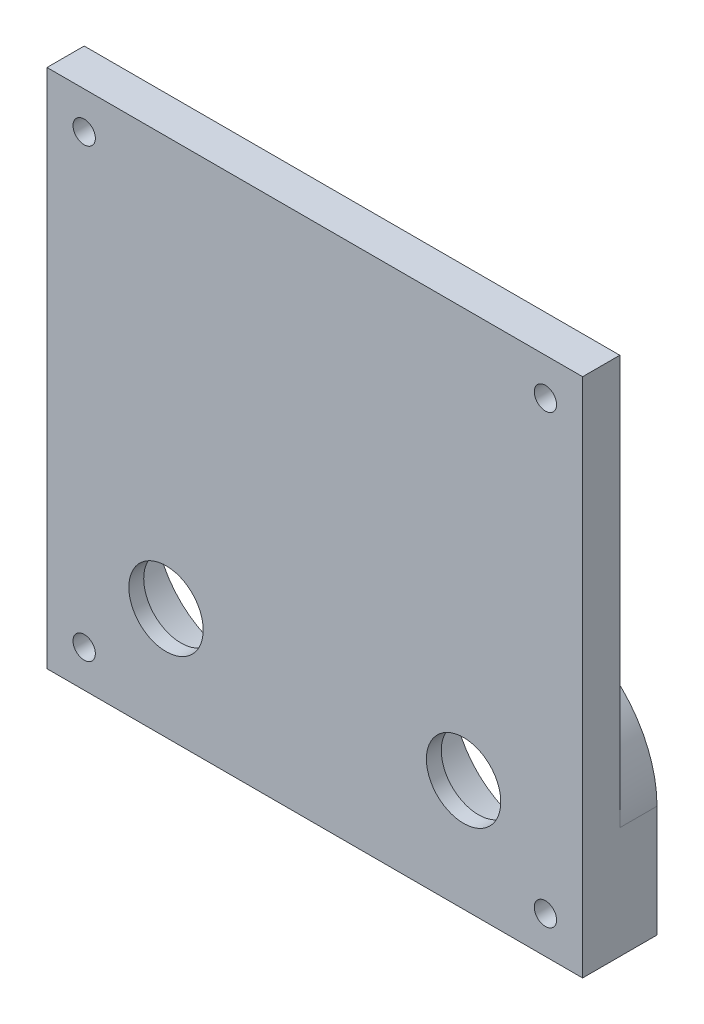
ISO-10303-21;
HEADER;
FILE_DESCRIPTION(('STEP AP214'),'2;1');
FILE_NAME('part.step','',(''),(''),'','','');
FILE_SCHEMA(('AUTOMOTIVE_DESIGN { 1 0 10303 214 1 1 1 1 }'));
ENDSEC;
DATA;
#1=APPLICATION_CONTEXT('core data for automotive mechanical design processes');
#2=APPLICATION_PROTOCOL_DEFINITION('international standard','automotive_design',2000,#1);
#3=PRODUCT_CONTEXT('',#1,'mechanical');
#4=PRODUCT('Part','Part','',(#3));
#5=PRODUCT_RELATED_PRODUCT_CATEGORY('part','',(#4));
#6=PRODUCT_DEFINITION_FORMATION('','',#4);
#7=PRODUCT_DEFINITION_CONTEXT('part definition',#1,'design');
#8=PRODUCT_DEFINITION('design','',#6,#7);
#9=PRODUCT_DEFINITION_SHAPE('','',#8);
#10=(LENGTH_UNIT() NAMED_UNIT(*) SI_UNIT(.MILLI.,.METRE.));
#11=(NAMED_UNIT(*) PLANE_ANGLE_UNIT() SI_UNIT($,.RADIAN.));
#12=(NAMED_UNIT(*) SI_UNIT($,.STERADIAN.) SOLID_ANGLE_UNIT());
#13=UNCERTAINTY_MEASURE_WITH_UNIT(LENGTH_MEASURE(1.E-05),#10,'distance_accuracy_value','');
#14=(GEOMETRIC_REPRESENTATION_CONTEXT(3) GLOBAL_UNCERTAINTY_ASSIGNED_CONTEXT((#13)) GLOBAL_UNIT_ASSIGNED_CONTEXT((#10,
#11,#12)) REPRESENTATION_CONTEXT('',''));
#15=CARTESIAN_POINT('',(0.,0.,0.));
#16=DIRECTION('',(0.,0.,1.));
#17=DIRECTION('',(1.,0.,0.));
#18=AXIS2_PLACEMENT_3D('',#15,#16,#17);
#19=CARTESIAN_POINT('',(59.5583044534633,70.,9.99999999999999));
#20=DIRECTION('',(0.,1.,0.));
#21=DIRECTION('',(0.,0.,1.));
#22=AXIS2_PLACEMENT_3D('',#19,#20,#21);
#23=PLANE('',#22);
#24=DIRECTION('',(1.,0.,0.));
#25=VECTOR('',#24,1.);
#26=CARTESIAN_POINT('',(59.5583044534633,70.,5.));
#27=LINE('',#26,#25);
#28=CARTESIAN_POINT('',(-1.,70.,5.));
#29=VERTEX_POINT('',#28);
#30=CARTESIAN_POINT('',(71.,70.,5.));
#31=VERTEX_POINT('',#30);
#32=EDGE_CURVE('E38',#29,#31,#27,.T.);
#33=ORIENTED_EDGE('',*,*,#32,.F.);
#34=DIRECTION('',(0.,0.,-1.));
#35=VECTOR('',#34,1.);
#36=CARTESIAN_POINT('',(-1.,70.,10.));
#37=LINE('',#36,#35);
#38=CARTESIAN_POINT('',(-1.,70.,10.));
#39=VERTEX_POINT('',#38);
#40=EDGE_CURVE('E189',#39,#29,#37,.T.);
#41=ORIENTED_EDGE('',*,*,#40,.F.);
#42=DIRECTION('',(1.,0.,0.));
#43=VECTOR('',#42,1.);
#44=CARTESIAN_POINT('',(59.5583044534633,70.,9.99999999999999));
#45=LINE('',#44,#43);
#46=CARTESIAN_POINT('',(71.,70.,10.));
#47=VERTEX_POINT('',#46);
#48=EDGE_CURVE('E11',#39,#47,#45,.T.);
#49=ORIENTED_EDGE('',*,*,#48,.T.);
#50=DIRECTION('',(0.,0.,-1.));
#51=VECTOR('',#50,1.);
#52=CARTESIAN_POINT('',(71.,70.,10.));
#53=LINE('',#52,#51);
#54=EDGE_CURVE('E197',#47,#31,#53,.T.);
#55=ORIENTED_EDGE('',*,*,#54,.T.);
#56=EDGE_LOOP('',(#33,#41,#49,#55));
#57=FACE_BOUND('',#56,.T.);
#58=ADVANCED_FACE('F34',(#57),#23,.T.);
#59=CARTESIAN_POINT('',(15.,15.,5.));
#60=DIRECTION('',(0.,0.,1.));
#61=DIRECTION('',(1.,0.,0.));
#62=AXIS2_PLACEMENT_3D('',#59,#60,#61);
#63=PLANE('',#62);
#64=ORIENTED_EDGE('',*,*,#32,.T.);
#65=DIRECTION('',(0.,1.,0.));
#66=VECTOR('',#65,1.);
#67=CARTESIAN_POINT('',(71.,0.,5.));
#68=LINE('',#67,#66);
#69=CARTESIAN_POINT('',(71.,15.,5.));
#70=VERTEX_POINT('',#69);
#71=EDGE_CURVE('E193',#70,#31,#68,.T.);
#72=ORIENTED_EDGE('',*,*,#71,.F.);
#73=CARTESIAN_POINT('',(55.,15.,5.));
#74=DIRECTION('',(0.,0.,-1.));
#75=DIRECTION('',(-1.,0.,0.));
#76=AXIS2_PLACEMENT_3D('',#73,#74,#75);
#77=CIRCLE('',#76,16.);
#78=CARTESIAN_POINT('',(39.,15.,5.));
#79=VERTEX_POINT('',#78);
#80=EDGE_CURVE('E206',#79,#70,#77,.T.);
#81=ORIENTED_EDGE('',*,*,#80,.F.);
#82=DIRECTION('',(0.,-1.,0.));
#83=VECTOR('',#82,1.);
#84=CARTESIAN_POINT('',(39.,15.,5.));
#85=LINE('',#84,#83);
#86=CARTESIAN_POINT('',(39.,0.,5.));
#87=VERTEX_POINT('',#86);
#88=EDGE_CURVE('E118',#79,#87,#85,.T.);
#89=ORIENTED_EDGE('',*,*,#88,.T.);
#90=DIRECTION('',(-1.,0.,0.));
#91=VECTOR('',#90,1.);
#92=CARTESIAN_POINT('',(39.,0.,5.));
#93=LINE('',#92,#91);
#94=CARTESIAN_POINT('',(31.,0.,5.));
#95=VERTEX_POINT('',#94);
#96=EDGE_CURVE('E110',#87,#95,#93,.T.);
#97=ORIENTED_EDGE('',*,*,#96,.T.);
#98=DIRECTION('',(0.,1.,0.));
#99=VECTOR('',#98,1.);
#100=CARTESIAN_POINT('',(31.,0.,5.));
#101=LINE('',#100,#99);
#102=CARTESIAN_POINT('',(31.,15.,5.));
#103=VERTEX_POINT('',#102);
#104=EDGE_CURVE('E102',#95,#103,#101,.T.);
#105=ORIENTED_EDGE('',*,*,#104,.T.);
#106=CARTESIAN_POINT('',(15.,15.,5.));
#107=DIRECTION('',(0.,0.,1.));
#108=DIRECTION('',(1.,0.,0.));
#109=AXIS2_PLACEMENT_3D('',#106,#107,#108);
#110=CIRCLE('',#109,16.);
#111=CARTESIAN_POINT('',(-1.,15.,5.));
#112=VERTEX_POINT('',#111);
#113=EDGE_CURVE('E94',#103,#112,#110,.T.);
#114=ORIENTED_EDGE('',*,*,#113,.T.);
#115=DIRECTION('',(0.,-1.,0.));
#116=VECTOR('',#115,1.);
#117=CARTESIAN_POINT('',(-1.,0.,5.));
#118=LINE('',#117,#116);
#119=EDGE_CURVE('E185',#29,#112,#118,.T.);
#120=ORIENTED_EDGE('',*,*,#119,.F.);
#121=EDGE_LOOP('',(#64,#72,#81,#89,#97,#105,#114,#120));
#122=FACE_BOUND('',#121,.T.);
#123=CARTESIAN_POINT('',(66.,65.,5.));
#124=DIRECTION('',(0.,0.,1.));
#125=DIRECTION('',(1.,0.,0.));
#126=AXIS2_PLACEMENT_3D('',#123,#124,#125);
#127=CIRCLE('',#126,1.5);
#128=CARTESIAN_POINT('',(67.5,65.,5.));
#129=VERTEX_POINT('',#128);
#130=EDGE_CURVE('E156',#129,#129,#127,.T.);
#131=ORIENTED_EDGE('',*,*,#130,.T.);
#132=EDGE_LOOP('',(#131));
#133=FACE_BOUND('',#132,.T.);
#134=CARTESIAN_POINT('',(4.,65.,5.));
#135=DIRECTION('',(0.,0.,1.));
#136=DIRECTION('',(1.,0.,0.));
#137=AXIS2_PLACEMENT_3D('',#134,#135,#136);
#138=CIRCLE('',#137,1.5);
#139=CARTESIAN_POINT('',(5.5,65.,5.));
#140=VERTEX_POINT('',#139);
#141=EDGE_CURVE('E161',#140,#140,#138,.T.);
#142=ORIENTED_EDGE('',*,*,#141,.T.);
#143=EDGE_LOOP('',(#142));
#144=FACE_BOUND('',#143,.T.);
#145=ADVANCED_FACE('F115',(#122,#133,#144),#63,.F.);
#146=CARTESIAN_POINT('',(35.,49.,10.));
#147=DIRECTION('',(0.,0.,-1.));
#148=DIRECTION('',(-1.,0.,0.));
#149=AXIS2_PLACEMENT_3D('',#146,#147,#148);
#150=PLANE('',#149);
#151=ORIENTED_EDGE('',*,*,#48,.F.);
#152=DIRECTION('',(0.,-1.,0.));
#153=VECTOR('',#152,1.);
#154=CARTESIAN_POINT('',(-1.,0.,10.));
#155=LINE('',#154,#153);
#156=CARTESIAN_POINT('',(-1.,0.,10.));
#157=VERTEX_POINT('',#156);
#158=EDGE_CURVE('E186',#39,#157,#155,.T.);
#159=ORIENTED_EDGE('',*,*,#158,.T.);
#160=DIRECTION('',(1.,0.,0.));
#161=VECTOR('',#160,1.);
#162=CARTESIAN_POINT('',(0.,0.,10.));
#163=LINE('',#162,#161);
#164=CARTESIAN_POINT('',(71.,0.,10.));
#165=VERTEX_POINT('',#164);
#166=EDGE_CURVE('E145',#157,#165,#163,.T.);
#167=ORIENTED_EDGE('',*,*,#166,.T.);
#168=DIRECTION('',(0.,1.,0.));
#169=VECTOR('',#168,1.);
#170=CARTESIAN_POINT('',(71.,0.,10.));
#171=LINE('',#170,#169);
#172=EDGE_CURVE('E194',#165,#47,#171,.T.);
#173=ORIENTED_EDGE('',*,*,#172,.T.);
#174=EDGE_LOOP('',(#151,#159,#167,#173));
#175=FACE_BOUND('',#174,.T.);
#176=CARTESIAN_POINT('',(55.,15.,10.));
#177=DIRECTION('',(0.,0.,-1.));
#178=DIRECTION('',(-1.,0.,0.));
#179=AXIS2_PLACEMENT_3D('',#176,#177,#178);
#180=CIRCLE('',#179,5.);
#181=CARTESIAN_POINT('',(50.,15.,10.));
#182=VERTEX_POINT('',#181);
#183=EDGE_CURVE('E331',#182,#182,#180,.T.);
#184=ORIENTED_EDGE('',*,*,#183,.T.);
#185=EDGE_LOOP('',(#184));
#186=FACE_BOUND('',#185,.T.);
#187=CARTESIAN_POINT('',(15.,15.,10.));
#188=DIRECTION('',(0.,0.,-1.));
#189=DIRECTION('',(-1.,0.,0.));
#190=AXIS2_PLACEMENT_3D('',#187,#188,#189);
#191=CIRCLE('',#190,5.);
#192=CARTESIAN_POINT('',(10.,15.,10.));
#193=VERTEX_POINT('',#192);
#194=EDGE_CURVE('E165',#193,#193,#191,.T.);
#195=ORIENTED_EDGE('',*,*,#194,.T.);
#196=EDGE_LOOP('',(#195));
#197=FACE_BOUND('',#196,.T.);
#198=CARTESIAN_POINT('',(66.,5.,10.));
#199=DIRECTION('',(0.,0.,-1.));
#200=DIRECTION('',(-1.,0.,0.));
#201=AXIS2_PLACEMENT_3D('',#198,#199,#200);
#202=CIRCLE('',#201,1.5);
#203=CARTESIAN_POINT('',(64.5,5.,10.));
#204=VERTEX_POINT('',#203);
#205=EDGE_CURVE('E169',#204,#204,#202,.T.);
#206=ORIENTED_EDGE('',*,*,#205,.T.);
#207=EDGE_LOOP('',(#206));
#208=FACE_BOUND('',#207,.T.);
#209=CARTESIAN_POINT('',(4.,5.,10.));
#210=DIRECTION('',(0.,0.,-1.));
#211=DIRECTION('',(-1.,0.,0.));
#212=AXIS2_PLACEMENT_3D('',#209,#210,#211);
#213=CIRCLE('',#212,1.5);
#214=CARTESIAN_POINT('',(2.5,5.,10.));
#215=VERTEX_POINT('',#214);
#216=EDGE_CURVE('E170',#215,#215,#213,.T.);
#217=ORIENTED_EDGE('',*,*,#216,.T.);
#218=EDGE_LOOP('',(#217));
#219=FACE_BOUND('',#218,.T.);
#220=CARTESIAN_POINT('',(4.,65.,10.));
#221=DIRECTION('',(0.,0.,-1.));
#222=DIRECTION('',(-1.,0.,0.));
#223=AXIS2_PLACEMENT_3D('',#220,#221,#222);
#224=CIRCLE('',#223,1.5);
#225=CARTESIAN_POINT('',(2.5,65.,10.));
#226=VERTEX_POINT('',#225);
#227=EDGE_CURVE('E164',#226,#226,#224,.T.);
#228=ORIENTED_EDGE('',*,*,#227,.T.);
#229=EDGE_LOOP('',(#228));
#230=FACE_BOUND('',#229,.T.);
#231=CARTESIAN_POINT('',(66.,65.,10.));
#232=DIRECTION('',(0.,0.,-1.));
#233=DIRECTION('',(-1.,0.,0.));
#234=AXIS2_PLACEMENT_3D('',#231,#232,#233);
#235=CIRCLE('',#234,1.5);
#236=CARTESIAN_POINT('',(64.5,65.,10.));
#237=VERTEX_POINT('',#236);
#238=EDGE_CURVE('E159',#237,#237,#235,.T.);
#239=ORIENTED_EDGE('',*,*,#238,.T.);
#240=EDGE_LOOP('',(#239));
#241=FACE_BOUND('',#240,.T.);
#242=ADVANCED_FACE('F36',(#175,#186,#197,#208,#219,#230,#241),#150,.F.);
#243=CARTESIAN_POINT('',(0.,0.,10.));
#244=DIRECTION('',(0.,1.,0.));
#245=DIRECTION('',(0.,0.,1.));
#246=AXIS2_PLACEMENT_3D('',#243,#244,#245);
#247=PLANE('',#246);
#248=ORIENTED_EDGE('',*,*,#166,.F.);
#249=DIRECTION('',(0.,0.,-1.));
#250=VECTOR('',#249,1.);
#251=CARTESIAN_POINT('',(-1.,0.,5.));
#252=LINE('',#251,#250);
#253=CARTESIAN_POINT('',(-1.,0.,0.));
#254=VERTEX_POINT('',#253);
#255=EDGE_CURVE('E136',#157,#254,#252,.T.);
#256=ORIENTED_EDGE('',*,*,#255,.T.);
#257=DIRECTION('',(1.,0.,0.));
#258=VECTOR('',#257,1.);
#259=CARTESIAN_POINT('',(0.,0.,0.));
#260=LINE('',#259,#258);
#261=CARTESIAN_POINT('',(31.,0.,0.));
#262=VERTEX_POINT('',#261);
#263=EDGE_CURVE('E127',#254,#262,#260,.T.);
#264=ORIENTED_EDGE('',*,*,#263,.T.);
#265=DIRECTION('',(0.,0.,-1.));
#266=VECTOR('',#265,1.);
#267=CARTESIAN_POINT('',(31.,0.,5.));
#268=LINE('',#267,#266);
#269=EDGE_CURVE('E107',#95,#262,#268,.T.);
#270=ORIENTED_EDGE('',*,*,#269,.F.);
#271=ORIENTED_EDGE('',*,*,#96,.F.);
#272=DIRECTION('',(0.,0.,-1.));
#273=VECTOR('',#272,1.);
#274=CARTESIAN_POINT('',(39.,0.,5.));
#275=LINE('',#274,#273);
#276=CARTESIAN_POINT('',(39.,0.,0.));
#277=VERTEX_POINT('',#276);
#278=EDGE_CURVE('E128',#87,#277,#275,.T.);
#279=ORIENTED_EDGE('',*,*,#278,.T.);
#280=CARTESIAN_POINT('',(71.,0.,0.));
#281=VERTEX_POINT('',#280);
#282=EDGE_CURVE('E142',#277,#281,#260,.T.);
#283=ORIENTED_EDGE('',*,*,#282,.T.);
#284=DIRECTION('',(0.,0.,-1.));
#285=VECTOR('',#284,1.);
#286=CARTESIAN_POINT('',(71.,0.,5.));
#287=LINE('',#286,#285);
#288=EDGE_CURVE('E85',#165,#281,#287,.T.);
#289=ORIENTED_EDGE('',*,*,#288,.F.);
#290=EDGE_LOOP('',(#248,#256,#264,#270,#271,#279,#283,#289));
#291=FACE_BOUND('',#290,.T.);
#292=ADVANCED_FACE('F124',(#291),#247,.F.);
#293=CARTESIAN_POINT('',(0.,0.,0.));
#294=DIRECTION('',(0.,0.,-1.));
#295=DIRECTION('',(-1.,0.,0.));
#296=AXIS2_PLACEMENT_3D('',#293,#294,#295);
#297=PLANE('',#296);
#298=CARTESIAN_POINT('',(4.,5.,0.));
#299=DIRECTION('',(0.,0.,-1.));
#300=DIRECTION('',(-1.,0.,0.));
#301=AXIS2_PLACEMENT_3D('',#298,#299,#300);
#302=CIRCLE('',#301,1.5);
#303=CARTESIAN_POINT('',(2.5,5.,0.));
#304=VERTEX_POINT('',#303);
#305=EDGE_CURVE('E160',#304,#304,#302,.T.);
#306=ORIENTED_EDGE('',*,*,#305,.F.);
#307=EDGE_LOOP('',(#306));
#308=FACE_BOUND('',#307,.T.);
#309=DIRECTION('',(0.,-1.,0.));
#310=VECTOR('',#309,1.);
#311=CARTESIAN_POINT('',(-1.,15.,0.));
#312=LINE('',#311,#310);
#313=CARTESIAN_POINT('',(-1.,15.,0.));
#314=VERTEX_POINT('',#313);
#315=EDGE_CURVE('E202',#314,#254,#312,.T.);
#316=ORIENTED_EDGE('',*,*,#315,.F.);
#317=CARTESIAN_POINT('',(15.,15.,0.));
#318=DIRECTION('',(0.,0.,1.));
#319=DIRECTION('',(1.,0.,0.));
#320=AXIS2_PLACEMENT_3D('',#317,#318,#319);
#321=CIRCLE('',#320,16.);
#322=CARTESIAN_POINT('',(31.,15.,0.));
#323=VERTEX_POINT('',#322);
#324=EDGE_CURVE('E209',#323,#314,#321,.T.);
#325=ORIENTED_EDGE('',*,*,#324,.F.);
#326=DIRECTION('',(0.,1.,0.));
#327=VECTOR('',#326,1.);
#328=CARTESIAN_POINT('',(31.,0.,0.));
#329=LINE('',#328,#327);
#330=EDGE_CURVE('E212',#262,#323,#329,.T.);
#331=ORIENTED_EDGE('',*,*,#330,.F.);
#332=ORIENTED_EDGE('',*,*,#263,.F.);
#333=EDGE_LOOP('',(#316,#325,#331,#332));
#334=FACE_BOUND('',#333,.T.);
#335=CARTESIAN_POINT('',(15.,15.,0.));
#336=DIRECTION('',(0.,0.,1.));
#337=DIRECTION('',(1.,0.,0.));
#338=AXIS2_PLACEMENT_3D('',#335,#336,#337);
#339=CIRCLE('',#338,11.5);
#340=CARTESIAN_POINT('',(26.5,15.,0.));
#341=VERTEX_POINT('',#340);
#342=EDGE_CURVE('E139',#341,#341,#339,.T.);
#343=ORIENTED_EDGE('',*,*,#342,.T.);
#344=EDGE_LOOP('',(#343));
#345=FACE_BOUND('',#344,.T.);
#346=ADVANCED_FACE('F254',(#308,#334,#345),#297,.T.);
#347=CARTESIAN_POINT('',(55.,15.,0.));
#348=DIRECTION('',(0.,0.,1.));
#349=DIRECTION('',(1.,0.,0.));
#350=AXIS2_PLACEMENT_3D('',#347,#348,#349);
#351=CYLINDRICAL_SURFACE('',#350,11.5);
#352=CARTESIAN_POINT('',(55.,15.,0.));
#353=DIRECTION('',(0.,0.,1.));
#354=DIRECTION('',(1.,0.,0.));
#355=AXIS2_PLACEMENT_3D('',#352,#353,#354);
#356=CIRCLE('',#355,11.5);
#357=CARTESIAN_POINT('',(66.5,15.,0.));
#358=VERTEX_POINT('',#357);
#359=EDGE_CURVE('E138',#358,#358,#356,.T.);
#360=ORIENTED_EDGE('',*,*,#359,.F.);
#361=EDGE_LOOP('',(#360));
#362=FACE_BOUND('',#361,.T.);
#363=CARTESIAN_POINT('',(55.,15.,8.));
#364=DIRECTION('',(0.,0.,1.));
#365=DIRECTION('',(1.,0.,0.));
#366=AXIS2_PLACEMENT_3D('',#363,#364,#365);
#367=CIRCLE('',#366,11.5);
#368=CARTESIAN_POINT('',(66.5,15.,8.));
#369=VERTEX_POINT('',#368);
#370=EDGE_CURVE('E153',#369,#369,#367,.F.);
#371=ORIENTED_EDGE('',*,*,#370,.F.);
#372=EDGE_LOOP('',(#371));
#373=FACE_BOUND('',#372,.T.);
#374=ADVANCED_FACE('F274',(#362,#373),#351,.F.);
#375=CARTESIAN_POINT('',(15.,15.,0.));
#376=DIRECTION('',(0.,0.,1.));
#377=DIRECTION('',(1.,0.,0.));
#378=AXIS2_PLACEMENT_3D('',#375,#376,#377);
#379=CYLINDRICAL_SURFACE('',#378,11.5);
#380=ORIENTED_EDGE('',*,*,#342,.F.);
#381=EDGE_LOOP('',(#380));
#382=FACE_BOUND('',#381,.T.);
#383=CARTESIAN_POINT('',(15.,15.,8.));
#384=DIRECTION('',(0.,0.,1.));
#385=DIRECTION('',(1.,0.,0.));
#386=AXIS2_PLACEMENT_3D('',#383,#384,#385);
#387=CIRCLE('',#386,11.5);
#388=CARTESIAN_POINT('',(26.5,15.,8.));
#389=VERTEX_POINT('',#388);
#390=EDGE_CURVE('E148',#389,#389,#387,.F.);
#391=ORIENTED_EDGE('',*,*,#390,.F.);
#392=EDGE_LOOP('',(#391));
#393=FACE_BOUND('',#392,.T.);
#394=ADVANCED_FACE('F272',(#382,#393),#379,.F.);
#395=CARTESIAN_POINT('',(66.,5.,0.));
#396=DIRECTION('',(0.,0.,-1.));
#397=DIRECTION('',(-1.,0.,0.));
#398=AXIS2_PLACEMENT_3D('',#395,#396,#397);
#399=CIRCLE('',#398,1.5);
#400=CARTESIAN_POINT('',(64.5,5.,0.));
#401=VERTEX_POINT('',#400);
#402=EDGE_CURVE('E166',#401,#401,#399,.T.);
#403=ORIENTED_EDGE('',*,*,#402,.F.);
#404=EDGE_LOOP('',(#403));
#405=FACE_BOUND('',#404,.T.);
#406=DIRECTION('',(0.,-1.,0.));
#407=VECTOR('',#406,1.);
#408=CARTESIAN_POINT('',(39.,15.,0.));
#409=LINE('',#408,#407);
#410=CARTESIAN_POINT('',(39.,15.,0.));
#411=VERTEX_POINT('',#410);
#412=EDGE_CURVE('E214',#411,#277,#409,.T.);
#413=ORIENTED_EDGE('',*,*,#412,.F.);
#414=CARTESIAN_POINT('',(55.,15.,0.));
#415=DIRECTION('',(0.,0.,-1.));
#416=DIRECTION('',(-1.,0.,0.));
#417=AXIS2_PLACEMENT_3D('',#414,#415,#416);
#418=CIRCLE('',#417,16.);
#419=CARTESIAN_POINT('',(71.,15.,0.));
#420=VERTEX_POINT('',#419);
#421=EDGE_CURVE('E216',#411,#420,#418,.T.);
#422=ORIENTED_EDGE('',*,*,#421,.T.);
#423=DIRECTION('',(0.,-1.,0.));
#424=VECTOR('',#423,1.);
#425=CARTESIAN_POINT('',(71.,15.,0.));
#426=LINE('',#425,#424);
#427=EDGE_CURVE('E203',#420,#281,#426,.T.);
#428=ORIENTED_EDGE('',*,*,#427,.T.);
#429=ORIENTED_EDGE('',*,*,#282,.F.);
#430=EDGE_LOOP('',(#413,#422,#428,#429));
#431=FACE_BOUND('',#430,.T.);
#432=ORIENTED_EDGE('',*,*,#359,.T.);
#433=EDGE_LOOP('',(#432));
#434=FACE_BOUND('',#433,.T.);
#435=ADVANCED_FACE('F227',(#405,#431,#434),#297,.T.);
#436=CARTESIAN_POINT('',(15.,15.,8.));
#437=DIRECTION('',(0.,0.,1.));
#438=DIRECTION('',(1.,0.,0.));
#439=AXIS2_PLACEMENT_3D('',#436,#437,#438);
#440=PLANE('',#439);
#441=CARTESIAN_POINT('',(15.,15.,8.));
#442=DIRECTION('',(0.,0.,-1.));
#443=DIRECTION('',(-1.,0.,0.));
#444=AXIS2_PLACEMENT_3D('',#441,#442,#443);
#445=CIRCLE('',#444,5.);
#446=CARTESIAN_POINT('',(10.,15.,8.));
#447=VERTEX_POINT('',#446);
#448=EDGE_CURVE('E332',#447,#447,#445,.T.);
#449=ORIENTED_EDGE('',*,*,#448,.F.);
#450=EDGE_LOOP('',(#449));
#451=FACE_BOUND('',#450,.T.);
#452=ORIENTED_EDGE('',*,*,#390,.T.);
#453=EDGE_LOOP('',(#452));
#454=FACE_BOUND('',#453,.T.);
#455=ADVANCED_FACE('F271',(#451,#454),#440,.F.);
#456=CARTESIAN_POINT('',(55.,15.,8.));
#457=DIRECTION('',(0.,0.,1.));
#458=DIRECTION('',(1.,0.,0.));
#459=AXIS2_PLACEMENT_3D('',#456,#457,#458);
#460=PLANE('',#459);
#461=CARTESIAN_POINT('',(55.,15.,8.));
#462=DIRECTION('',(0.,0.,-1.));
#463=DIRECTION('',(-1.,0.,0.));
#464=AXIS2_PLACEMENT_3D('',#461,#462,#463);
#465=CIRCLE('',#464,5.);
#466=CARTESIAN_POINT('',(50.,15.,8.));
#467=VERTEX_POINT('',#466);
#468=EDGE_CURVE('E328',#467,#467,#465,.T.);
#469=ORIENTED_EDGE('',*,*,#468,.F.);
#470=EDGE_LOOP('',(#469));
#471=FACE_BOUND('',#470,.T.);
#472=ORIENTED_EDGE('',*,*,#370,.T.);
#473=EDGE_LOOP('',(#472));
#474=FACE_BOUND('',#473,.T.);
#475=ADVANCED_FACE('F283',(#471,#474),#460,.F.);
#476=CARTESIAN_POINT('',(-1.,15.,5.));
#477=DIRECTION('',(1.,0.,0.));
#478=DIRECTION('',(0.,0.,-1.));
#479=AXIS2_PLACEMENT_3D('',#476,#477,#478);
#480=PLANE('',#479);
#481=ORIENTED_EDGE('',*,*,#315,.T.);
#482=ORIENTED_EDGE('',*,*,#255,.F.);
#483=ORIENTED_EDGE('',*,*,#158,.F.);
#484=ORIENTED_EDGE('',*,*,#40,.T.);
#485=ORIENTED_EDGE('',*,*,#119,.T.);
#486=DIRECTION('',(0.,0.,-1.));
#487=VECTOR('',#486,1.);
#488=CARTESIAN_POINT('',(-1.,15.,5.));
#489=LINE('',#488,#487);
#490=EDGE_CURVE('E130',#112,#314,#489,.T.);
#491=ORIENTED_EDGE('',*,*,#490,.T.);
#492=EDGE_LOOP('',(#481,#482,#483,#484,#485,#491));
#493=FACE_BOUND('',#492,.T.);
#494=ADVANCED_FACE('F251',(#493),#480,.F.);
#495=CARTESIAN_POINT('',(15.,15.,5.));
#496=DIRECTION('',(0.,0.,-1.));
#497=DIRECTION('',(-1.,0.,0.));
#498=AXIS2_PLACEMENT_3D('',#495,#496,#497);
#499=CYLINDRICAL_SURFACE('',#498,16.);
#500=ORIENTED_EDGE('',*,*,#324,.T.);
#501=ORIENTED_EDGE('',*,*,#490,.F.);
#502=ORIENTED_EDGE('',*,*,#113,.F.);
#503=DIRECTION('',(0.,0.,-1.));
#504=VECTOR('',#503,1.);
#505=CARTESIAN_POINT('',(31.,15.,5.));
#506=LINE('',#505,#504);
#507=EDGE_CURVE('E109',#103,#323,#506,.T.);
#508=ORIENTED_EDGE('',*,*,#507,.T.);
#509=EDGE_LOOP('',(#500,#501,#502,#508));
#510=FACE_BOUND('',#509,.T.);
#511=ADVANCED_FACE('F259',(#510),#499,.T.);
#512=CARTESIAN_POINT('',(31.,0.,5.));
#513=DIRECTION('',(-1.,0.,0.));
#514=DIRECTION('',(0.,0.,1.));
#515=AXIS2_PLACEMENT_3D('',#512,#513,#514);
#516=PLANE('',#515);
#517=ORIENTED_EDGE('',*,*,#330,.T.);
#518=ORIENTED_EDGE('',*,*,#507,.F.);
#519=ORIENTED_EDGE('',*,*,#104,.F.);
#520=ORIENTED_EDGE('',*,*,#269,.T.);
#521=EDGE_LOOP('',(#517,#518,#519,#520));
#522=FACE_BOUND('',#521,.T.);
#523=ADVANCED_FACE('F105',(#522),#516,.F.);
#524=CARTESIAN_POINT('',(39.,15.,5.));
#525=DIRECTION('',(1.,0.,0.));
#526=DIRECTION('',(0.,0.,-1.));
#527=AXIS2_PLACEMENT_3D('',#524,#525,#526);
#528=PLANE('',#527);
#529=ORIENTED_EDGE('',*,*,#412,.T.);
#530=ORIENTED_EDGE('',*,*,#278,.F.);
#531=ORIENTED_EDGE('',*,*,#88,.F.);
#532=DIRECTION('',(0.,0.,-1.));
#533=VECTOR('',#532,1.);
#534=CARTESIAN_POINT('',(39.,15.,5.));
#535=LINE('',#534,#533);
#536=EDGE_CURVE('E51',#79,#411,#535,.T.);
#537=ORIENTED_EDGE('',*,*,#536,.T.);
#538=EDGE_LOOP('',(#529,#530,#531,#537));
#539=FACE_BOUND('',#538,.T.);
#540=ADVANCED_FACE('F222',(#539),#528,.F.);
#541=CARTESIAN_POINT('',(55.,15.,5.));
#542=DIRECTION('',(0.,0.,-1.));
#543=DIRECTION('',(-1.,0.,0.));
#544=AXIS2_PLACEMENT_3D('',#541,#542,#543);
#545=CYLINDRICAL_SURFACE('',#544,16.);
#546=ORIENTED_EDGE('',*,*,#421,.F.);
#547=ORIENTED_EDGE('',*,*,#536,.F.);
#548=ORIENTED_EDGE('',*,*,#80,.T.);
#549=DIRECTION('',(0.,0.,-1.));
#550=VECTOR('',#549,1.);
#551=CARTESIAN_POINT('',(71.,15.,5.));
#552=LINE('',#551,#550);
#553=EDGE_CURVE('E78',#70,#420,#552,.T.);
#554=ORIENTED_EDGE('',*,*,#553,.T.);
#555=EDGE_LOOP('',(#546,#547,#548,#554));
#556=FACE_BOUND('',#555,.T.);
#557=ADVANCED_FACE('F224',(#556),#545,.T.);
#558=CARTESIAN_POINT('',(71.,15.,5.));
#559=DIRECTION('',(1.,0.,0.));
#560=DIRECTION('',(0.,0.,-1.));
#561=AXIS2_PLACEMENT_3D('',#558,#559,#560);
#562=PLANE('',#561);
#563=ORIENTED_EDGE('',*,*,#427,.F.);
#564=ORIENTED_EDGE('',*,*,#553,.F.);
#565=ORIENTED_EDGE('',*,*,#71,.T.);
#566=ORIENTED_EDGE('',*,*,#54,.F.);
#567=ORIENTED_EDGE('',*,*,#172,.F.);
#568=ORIENTED_EDGE('',*,*,#288,.T.);
#569=EDGE_LOOP('',(#563,#564,#565,#566,#567,#568));
#570=FACE_BOUND('',#569,.T.);
#571=ADVANCED_FACE('F234',(#570),#562,.T.);
#572=CARTESIAN_POINT('',(66.,65.,53.));
#573=DIRECTION('',(0.,0.,-1.));
#574=DIRECTION('',(-1.,0.,0.));
#575=AXIS2_PLACEMENT_3D('',#572,#573,#574);
#576=CYLINDRICAL_SURFACE('',#575,1.5);
#577=ORIENTED_EDGE('',*,*,#130,.F.);
#578=EDGE_LOOP('',(#577));
#579=FACE_BOUND('',#578,.T.);
#580=ORIENTED_EDGE('',*,*,#238,.F.);
#581=EDGE_LOOP('',(#580));
#582=FACE_BOUND('',#581,.T.);
#583=ADVANCED_FACE('F300',(#579,#582),#576,.F.);
#584=CARTESIAN_POINT('',(4.,65.,53.));
#585=DIRECTION('',(0.,0.,-1.));
#586=DIRECTION('',(-1.,0.,0.));
#587=AXIS2_PLACEMENT_3D('',#584,#585,#586);
#588=CYLINDRICAL_SURFACE('',#587,1.5);
#589=ORIENTED_EDGE('',*,*,#141,.F.);
#590=EDGE_LOOP('',(#589));
#591=FACE_BOUND('',#590,.T.);
#592=ORIENTED_EDGE('',*,*,#227,.F.);
#593=EDGE_LOOP('',(#592));
#594=FACE_BOUND('',#593,.T.);
#595=ADVANCED_FACE('F303',(#591,#594),#588,.F.);
#596=CARTESIAN_POINT('',(66.,5.,53.));
#597=DIRECTION('',(0.,0.,-1.));
#598=DIRECTION('',(-1.,0.,0.));
#599=AXIS2_PLACEMENT_3D('',#596,#597,#598);
#600=CYLINDRICAL_SURFACE('',#599,1.5);
#601=ORIENTED_EDGE('',*,*,#402,.T.);
#602=EDGE_LOOP('',(#601));
#603=FACE_BOUND('',#602,.T.);
#604=ORIENTED_EDGE('',*,*,#205,.F.);
#605=EDGE_LOOP('',(#604));
#606=FACE_BOUND('',#605,.T.);
#607=ADVANCED_FACE('F307',(#603,#606),#600,.F.);
#608=CARTESIAN_POINT('',(4.,5.,53.));
#609=DIRECTION('',(0.,0.,-1.));
#610=DIRECTION('',(-1.,0.,0.));
#611=AXIS2_PLACEMENT_3D('',#608,#609,#610);
#612=CYLINDRICAL_SURFACE('',#611,1.5);
#613=ORIENTED_EDGE('',*,*,#305,.T.);
#614=EDGE_LOOP('',(#613));
#615=FACE_BOUND('',#614,.T.);
#616=ORIENTED_EDGE('',*,*,#216,.F.);
#617=EDGE_LOOP('',(#616));
#618=FACE_BOUND('',#617,.T.);
#619=ADVANCED_FACE('F309',(#615,#618),#612,.F.);
#620=CARTESIAN_POINT('',(15.,15.,27.));
#621=DIRECTION('',(0.,0.,-1.));
#622=DIRECTION('',(-1.,0.,0.));
#623=AXIS2_PLACEMENT_3D('',#620,#621,#622);
#624=CYLINDRICAL_SURFACE('',#623,5.);
#625=ORIENTED_EDGE('',*,*,#448,.T.);
#626=EDGE_LOOP('',(#625));
#627=FACE_BOUND('',#626,.T.);
#628=ORIENTED_EDGE('',*,*,#194,.F.);
#629=EDGE_LOOP('',(#628));
#630=FACE_BOUND('',#629,.T.);
#631=ADVANCED_FACE('F312',(#627,#630),#624,.F.);
#632=CARTESIAN_POINT('',(55.,15.,27.));
#633=DIRECTION('',(0.,0.,-1.));
#634=DIRECTION('',(-1.,0.,0.));
#635=AXIS2_PLACEMENT_3D('',#632,#633,#634);
#636=CYLINDRICAL_SURFACE('',#635,5.);
#637=ORIENTED_EDGE('',*,*,#468,.T.);
#638=EDGE_LOOP('',(#637));
#639=FACE_BOUND('',#638,.T.);
#640=ORIENTED_EDGE('',*,*,#183,.F.);
#641=EDGE_LOOP('',(#640));
#642=FACE_BOUND('',#641,.T.);
#643=ADVANCED_FACE('F319',(#639,#642),#636,.F.);
#644=CLOSED_SHELL('',(#58,#145,#242,#292,#346,#374,#394,#435,#455,#475,#494,#511,#523,#540,#557,
#571,#583,#595,#607,#619,#631,#643));
#645=MANIFOLD_SOLID_BREP('B2',#644);
#646=ADVANCED_BREP_SHAPE_REPRESENTATION('',(#18,#645),#14);
#647=SHAPE_DEFINITION_REPRESENTATION(#9,#646);
ENDSEC;
END-ISO-10303-21;
